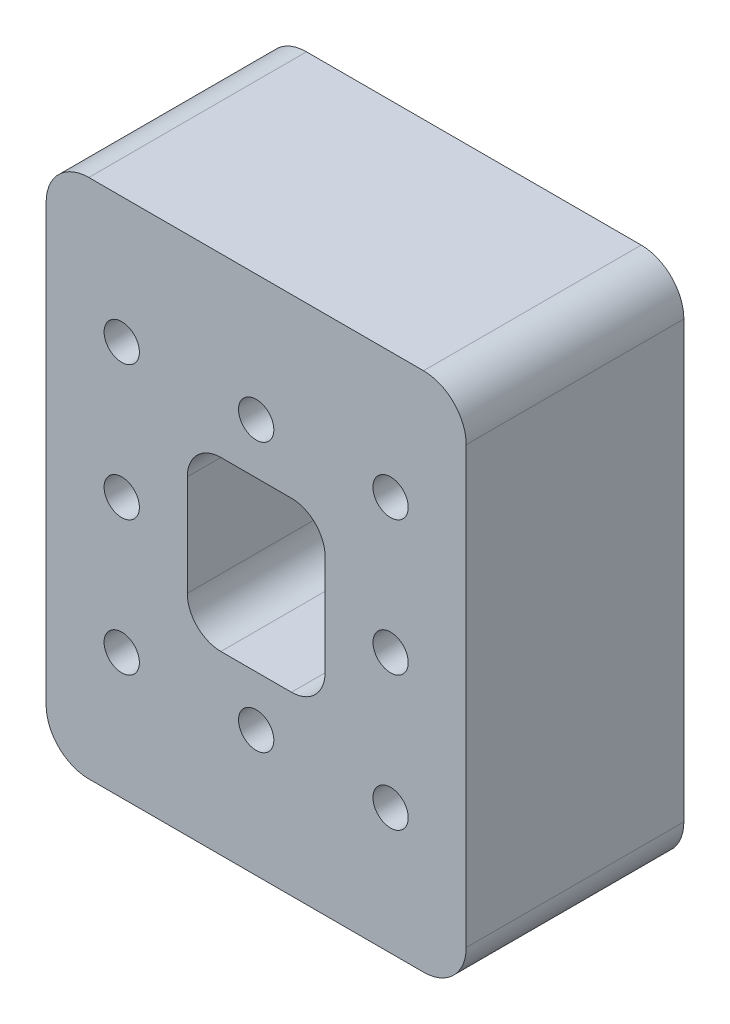
ISO-10303-21;
HEADER;
FILE_DESCRIPTION(('STEP AP214'),'2;1');
FILE_NAME('part.step','',(''),(''),'','','');
FILE_SCHEMA(('AUTOMOTIVE_DESIGN { 1 0 10303 214 1 1 1 1 }'));
ENDSEC;
DATA;
#1=APPLICATION_CONTEXT('core data for automotive mechanical design processes');
#2=APPLICATION_PROTOCOL_DEFINITION('international standard','automotive_design',2000,#1);
#3=PRODUCT_CONTEXT('',#1,'mechanical');
#4=PRODUCT('Part','Part','',(#3));
#5=PRODUCT_RELATED_PRODUCT_CATEGORY('part','',(#4));
#6=PRODUCT_DEFINITION_FORMATION('','',#4);
#7=PRODUCT_DEFINITION_CONTEXT('part definition',#1,'design');
#8=PRODUCT_DEFINITION('design','',#6,#7);
#9=PRODUCT_DEFINITION_SHAPE('','',#8);
#10=(LENGTH_UNIT() NAMED_UNIT(*) SI_UNIT(.MILLI.,.METRE.));
#11=(NAMED_UNIT(*) PLANE_ANGLE_UNIT() SI_UNIT($,.RADIAN.));
#12=(NAMED_UNIT(*) SI_UNIT($,.STERADIAN.) SOLID_ANGLE_UNIT());
#13=UNCERTAINTY_MEASURE_WITH_UNIT(LENGTH_MEASURE(1.E-05),#10,'distance_accuracy_value','');
#14=(GEOMETRIC_REPRESENTATION_CONTEXT(3) GLOBAL_UNCERTAINTY_ASSIGNED_CONTEXT((#13)) GLOBAL_UNIT_ASSIGNED_CONTEXT((#10,
#11,#12)) REPRESENTATION_CONTEXT('',''));
#15=CARTESIAN_POINT('',(0.,0.,0.));
#16=DIRECTION('',(0.,0.,1.));
#17=DIRECTION('',(1.,0.,0.));
#18=AXIS2_PLACEMENT_3D('',#15,#16,#17);
#19=CARTESIAN_POINT('',(2.54000000000001,-2.54,-12.954));
#20=DIRECTION('',(0.,0.,1.));
#21=DIRECTION('',(1.,0.,0.));
#22=AXIS2_PLACEMENT_3D('',#19,#20,#21);
#23=PLANE('',#22);
#24=CARTESIAN_POINT('',(2.54000000000001,-2.54,-12.954));
#25=DIRECTION('',(0.,0.,-1.));
#26=DIRECTION('',(1.,0.,0.));
#27=AXIS2_PLACEMENT_3D('',#24,#25,#26);
#28=CIRCLE('',#27,2.54);
#29=CARTESIAN_POINT('',(0.,-2.54000000000003,-12.954));
#30=VERTEX_POINT('',#29);
#31=CARTESIAN_POINT('',(2.54000000000003,0.,-12.954));
#32=VERTEX_POINT('',#31);
#33=EDGE_CURVE('E245',#30,#32,#28,.T.);
#34=ORIENTED_EDGE('',*,*,#33,.T.);
#35=DIRECTION('',(1.,0.,0.));
#36=VECTOR('',#35,1.);
#37=CARTESIAN_POINT('',(22.46,0.,-12.954));
#38=LINE('',#37,#36);
#39=CARTESIAN_POINT('',(22.46,0.,-12.954));
#40=VERTEX_POINT('',#39);
#41=EDGE_CURVE('E249',#32,#40,#38,.T.);
#42=ORIENTED_EDGE('',*,*,#41,.T.);
#43=CARTESIAN_POINT('',(22.46,-2.54,-12.954));
#44=DIRECTION('',(0.,0.,-1.));
#45=DIRECTION('',(1.,0.,0.));
#46=AXIS2_PLACEMENT_3D('',#43,#44,#45);
#47=CIRCLE('',#46,2.54);
#48=CARTESIAN_POINT('',(25.,-2.54000000000002,-12.954));
#49=VERTEX_POINT('',#48);
#50=EDGE_CURVE('E253',#40,#49,#47,.T.);
#51=ORIENTED_EDGE('',*,*,#50,.T.);
#52=DIRECTION('',(0.,-1.,0.));
#53=VECTOR('',#52,1.);
#54=CARTESIAN_POINT('',(25.,-28.46,-12.954));
#55=LINE('',#54,#53);
#56=CARTESIAN_POINT('',(25.,-28.46,-12.954));
#57=VERTEX_POINT('',#56);
#58=EDGE_CURVE('E256',#49,#57,#55,.T.);
#59=ORIENTED_EDGE('',*,*,#58,.T.);
#60=CARTESIAN_POINT('',(22.46,-28.46,-12.954));
#61=DIRECTION('',(0.,0.,-1.));
#62=DIRECTION('',(1.,0.,0.));
#63=AXIS2_PLACEMENT_3D('',#60,#61,#62);
#64=CIRCLE('',#63,2.54);
#65=CARTESIAN_POINT('',(22.46,-31.,-12.954));
#66=VERTEX_POINT('',#65);
#67=EDGE_CURVE('E259',#57,#66,#64,.T.);
#68=ORIENTED_EDGE('',*,*,#67,.T.);
#69=DIRECTION('',(-1.,0.,0.));
#70=VECTOR('',#69,1.);
#71=CARTESIAN_POINT('',(2.54000000000011,-31.,-12.954));
#72=LINE('',#71,#70);
#73=CARTESIAN_POINT('',(2.54000000000011,-31.,-12.954));
#74=VERTEX_POINT('',#73);
#75=EDGE_CURVE('E262',#66,#74,#72,.T.);
#76=ORIENTED_EDGE('',*,*,#75,.T.);
#77=CARTESIAN_POINT('',(2.54000000000009,-28.46,-12.954));
#78=DIRECTION('',(0.,0.,-1.));
#79=DIRECTION('',(1.,0.,0.));
#80=AXIS2_PLACEMENT_3D('',#77,#78,#79);
#81=CIRCLE('',#80,2.54);
#82=CARTESIAN_POINT('',(0.,-28.46,-12.954));
#83=VERTEX_POINT('',#82);
#84=EDGE_CURVE('E265',#74,#83,#81,.T.);
#85=ORIENTED_EDGE('',*,*,#84,.T.);
#86=DIRECTION('',(0.,1.,0.));
#87=VECTOR('',#86,1.);
#88=CARTESIAN_POINT('',(0.,-2.54000000000003,-12.954));
#89=LINE('',#88,#87);
#90=EDGE_CURVE('E268',#83,#30,#89,.T.);
#91=ORIENTED_EDGE('',*,*,#90,.T.);
#92=EDGE_LOOP('',(#34,#42,#51,#59,#68,#76,#85,#91));
#93=FACE_BOUND('',#92,.T.);
#94=CARTESIAN_POINT('',(14.6,-12.4996962120548,-12.954));
#95=DIRECTION('',(0.,0.,-1.));
#96=DIRECTION('',(-1.,0.,0.));
#97=AXIS2_PLACEMENT_3D('',#94,#95,#96);
#98=CIRCLE('',#97,2.00000000000002);
#99=CARTESIAN_POINT('',(14.6,-10.4996962120548,-12.954));
#100=VERTEX_POINT('',#99);
#101=CARTESIAN_POINT('',(16.6,-12.4996962120548,-12.954));
#102=VERTEX_POINT('',#101);
#103=EDGE_CURVE('E153',#100,#102,#98,.T.);
#104=ORIENTED_EDGE('',*,*,#103,.F.);
#105=DIRECTION('',(1.,0.,0.));
#106=VECTOR('',#105,1.);
#107=CARTESIAN_POINT('',(10.4,-10.4996962120548,-12.954));
#108=LINE('',#107,#106);
#109=CARTESIAN_POINT('',(10.4,-10.4996962120548,-12.954));
#110=VERTEX_POINT('',#109);
#111=EDGE_CURVE('E196',#110,#100,#108,.T.);
#112=ORIENTED_EDGE('',*,*,#111,.F.);
#113=CARTESIAN_POINT('',(10.4,-12.4996962120548,-12.954));
#114=DIRECTION('',(0.,0.,-1.));
#115=DIRECTION('',(-1.,0.,0.));
#116=AXIS2_PLACEMENT_3D('',#113,#114,#115);
#117=CIRCLE('',#116,2.);
#118=CARTESIAN_POINT('',(8.4,-12.4996962120548,-12.954));
#119=VERTEX_POINT('',#118);
#120=EDGE_CURVE('E193',#119,#110,#117,.T.);
#121=ORIENTED_EDGE('',*,*,#120,.F.);
#122=DIRECTION('',(0.,1.,0.));
#123=VECTOR('',#122,1.);
#124=CARTESIAN_POINT('',(8.4,-18.5003037879452,-12.954));
#125=LINE('',#124,#123);
#126=CARTESIAN_POINT('',(8.4,-18.5003037879452,-12.954));
#127=VERTEX_POINT('',#126);
#128=EDGE_CURVE('E190',#127,#119,#125,.T.);
#129=ORIENTED_EDGE('',*,*,#128,.F.);
#130=CARTESIAN_POINT('',(10.4,-18.5003037879452,-12.954));
#131=DIRECTION('',(0.,0.,-1.));
#132=DIRECTION('',(-1.,0.,0.));
#133=AXIS2_PLACEMENT_3D('',#130,#131,#132);
#134=CIRCLE('',#133,1.99999999999997);
#135=CARTESIAN_POINT('',(10.4,-20.5003037879451,-12.954));
#136=VERTEX_POINT('',#135);
#137=EDGE_CURVE('E187',#136,#127,#134,.T.);
#138=ORIENTED_EDGE('',*,*,#137,.F.);
#139=DIRECTION('',(-1.,0.,0.));
#140=VECTOR('',#139,1.);
#141=CARTESIAN_POINT('',(14.6,-20.5003037879451,-12.954));
#142=LINE('',#141,#140);
#143=CARTESIAN_POINT('',(14.6,-20.5003037879451,-12.954));
#144=VERTEX_POINT('',#143);
#145=EDGE_CURVE('E181',#144,#136,#142,.T.);
#146=ORIENTED_EDGE('',*,*,#145,.F.);
#147=CARTESIAN_POINT('',(14.6,-18.5003037879452,-12.954));
#148=DIRECTION('',(0.,0.,-1.));
#149=DIRECTION('',(-1.,0.,0.));
#150=AXIS2_PLACEMENT_3D('',#147,#148,#149);
#151=CIRCLE('',#150,1.99999999999992);
#152=CARTESIAN_POINT('',(16.5999999999999,-18.5003037879452,-12.954));
#153=VERTEX_POINT('',#152);
#154=EDGE_CURVE('E177',#153,#144,#151,.T.);
#155=ORIENTED_EDGE('',*,*,#154,.F.);
#156=DIRECTION('',(0.,-1.,0.));
#157=VECTOR('',#156,1.);
#158=CARTESIAN_POINT('',(16.6,-12.4996962120548,-12.954));
#159=LINE('',#158,#157);
#160=EDGE_CURVE('E162',#102,#153,#159,.T.);
#161=ORIENTED_EDGE('',*,*,#160,.F.);
#162=EDGE_LOOP('',(#104,#112,#121,#129,#138,#146,#155,#161));
#163=FACE_BOUND('',#162,.T.);
#164=CARTESIAN_POINT('',(12.5,-23.5,-12.954));
#165=DIRECTION('',(0.,0.,-1.));
#166=DIRECTION('',(-1.,0.,0.));
#167=AXIS2_PLACEMENT_3D('',#164,#165,#166);
#168=CIRCLE('',#167,1.05);
#169=CARTESIAN_POINT('',(11.45,-23.5,-12.954));
#170=VERTEX_POINT('',#169);
#171=EDGE_CURVE('E201',#170,#170,#168,.T.);
#172=ORIENTED_EDGE('',*,*,#171,.F.);
#173=EDGE_LOOP('',(#172));
#174=FACE_BOUND('',#173,.T.);
#175=CARTESIAN_POINT('',(20.5,-23.5,-12.954));
#176=DIRECTION('',(0.,0.,-1.));
#177=DIRECTION('',(-1.,0.,0.));
#178=AXIS2_PLACEMENT_3D('',#175,#176,#177);
#179=CIRCLE('',#178,1.05);
#180=CARTESIAN_POINT('',(19.45,-23.5,-12.954));
#181=VERTEX_POINT('',#180);
#182=EDGE_CURVE('E498',#181,#181,#179,.T.);
#183=ORIENTED_EDGE('',*,*,#182,.F.);
#184=EDGE_LOOP('',(#183));
#185=FACE_BOUND('',#184,.T.);
#186=CARTESIAN_POINT('',(4.5,-7.5,-12.954));
#187=DIRECTION('',(0.,0.,-1.));
#188=DIRECTION('',(-1.,0.,0.));
#189=AXIS2_PLACEMENT_3D('',#186,#187,#188);
#190=CIRCLE('',#189,1.05);
#191=CARTESIAN_POINT('',(3.45,-7.5,-12.954));
#192=VERTEX_POINT('',#191);
#193=EDGE_CURVE('E490',#192,#192,#190,.T.);
#194=ORIENTED_EDGE('',*,*,#193,.F.);
#195=EDGE_LOOP('',(#194));
#196=FACE_BOUND('',#195,.T.);
#197=CARTESIAN_POINT('',(12.5,-7.5,-12.954));
#198=DIRECTION('',(0.,0.,-1.));
#199=DIRECTION('',(-1.,0.,0.));
#200=AXIS2_PLACEMENT_3D('',#197,#198,#199);
#201=CIRCLE('',#200,1.05);
#202=CARTESIAN_POINT('',(11.45,-7.5,-12.954));
#203=VERTEX_POINT('',#202);
#204=EDGE_CURVE('E482',#203,#203,#201,.T.);
#205=ORIENTED_EDGE('',*,*,#204,.F.);
#206=EDGE_LOOP('',(#205));
#207=FACE_BOUND('',#206,.T.);
#208=CARTESIAN_POINT('',(20.5,-7.5,-12.954));
#209=DIRECTION('',(0.,0.,-1.));
#210=DIRECTION('',(-1.,0.,0.));
#211=AXIS2_PLACEMENT_3D('',#208,#209,#210);
#212=CIRCLE('',#211,1.05);
#213=CARTESIAN_POINT('',(19.45,-7.5,-12.954));
#214=VERTEX_POINT('',#213);
#215=EDGE_CURVE('E474',#214,#214,#212,.T.);
#216=ORIENTED_EDGE('',*,*,#215,.F.);
#217=EDGE_LOOP('',(#216));
#218=FACE_BOUND('',#217,.T.);
#219=CARTESIAN_POINT('',(4.5,-15.5,-12.954));
#220=DIRECTION('',(0.,0.,-1.));
#221=DIRECTION('',(-1.,0.,0.));
#222=AXIS2_PLACEMENT_3D('',#219,#220,#221);
#223=CIRCLE('',#222,1.05);
#224=CARTESIAN_POINT('',(3.45,-15.5,-12.954));
#225=VERTEX_POINT('',#224);
#226=EDGE_CURVE('E466',#225,#225,#223,.T.);
#227=ORIENTED_EDGE('',*,*,#226,.F.);
#228=EDGE_LOOP('',(#227));
#229=FACE_BOUND('',#228,.T.);
#230=CARTESIAN_POINT('',(20.5,-15.5,-12.954));
#231=DIRECTION('',(0.,0.,-1.));
#232=DIRECTION('',(-1.,0.,0.));
#233=AXIS2_PLACEMENT_3D('',#230,#231,#232);
#234=CIRCLE('',#233,1.05);
#235=CARTESIAN_POINT('',(19.45,-15.5,-12.954));
#236=VERTEX_POINT('',#235);
#237=EDGE_CURVE('E458',#236,#236,#234,.T.);
#238=ORIENTED_EDGE('',*,*,#237,.F.);
#239=EDGE_LOOP('',(#238));
#240=FACE_BOUND('',#239,.T.);
#241=CARTESIAN_POINT('',(4.5,-23.5,-12.954));
#242=DIRECTION('',(0.,0.,-1.));
#243=DIRECTION('',(-1.,0.,0.));
#244=AXIS2_PLACEMENT_3D('',#241,#242,#243);
#245=CIRCLE('',#244,1.05);
#246=CARTESIAN_POINT('',(3.45,-23.5,-12.954));
#247=VERTEX_POINT('',#246);
#248=EDGE_CURVE('E447',#247,#247,#245,.T.);
#249=ORIENTED_EDGE('',*,*,#248,.F.);
#250=EDGE_LOOP('',(#249));
#251=FACE_BOUND('',#250,.T.);
#252=ADVANCED_FACE('F39',(#93,#163,#174,#185,#196,#207,#218,#229,#240,#251),#23,.F.);
#253=CARTESIAN_POINT('',(2.54000000000001,-2.54,0.));
#254=DIRECTION('',(0.,0.,1.));
#255=DIRECTION('',(1.,0.,0.));
#256=AXIS2_PLACEMENT_3D('',#253,#254,#255);
#257=PLANE('',#256);
#258=CARTESIAN_POINT('',(20.5,-15.5,0.));
#259=DIRECTION('',(0.,0.,-1.));
#260=DIRECTION('',(-1.,0.,0.));
#261=AXIS2_PLACEMENT_3D('',#258,#259,#260);
#262=CIRCLE('',#261,1.05);
#263=CARTESIAN_POINT('',(19.45,-15.5,0.));
#264=VERTEX_POINT('',#263);
#265=EDGE_CURVE('E455',#264,#264,#262,.T.);
#266=ORIENTED_EDGE('',*,*,#265,.T.);
#267=EDGE_LOOP('',(#266));
#268=FACE_BOUND('',#267,.T.);
#269=CARTESIAN_POINT('',(20.5,-7.5,0.));
#270=DIRECTION('',(0.,0.,-1.));
#271=DIRECTION('',(-1.,0.,0.));
#272=AXIS2_PLACEMENT_3D('',#269,#270,#271);
#273=CIRCLE('',#272,1.05);
#274=CARTESIAN_POINT('',(19.45,-7.5,0.));
#275=VERTEX_POINT('',#274);
#276=EDGE_CURVE('E470',#275,#275,#273,.T.);
#277=ORIENTED_EDGE('',*,*,#276,.T.);
#278=EDGE_LOOP('',(#277));
#279=FACE_BOUND('',#278,.T.);
#280=CARTESIAN_POINT('',(4.5,-7.5,0.));
#281=DIRECTION('',(0.,0.,-1.));
#282=DIRECTION('',(-1.,0.,0.));
#283=AXIS2_PLACEMENT_3D('',#280,#281,#282);
#284=CIRCLE('',#283,1.05);
#285=CARTESIAN_POINT('',(3.45,-7.5,0.));
#286=VERTEX_POINT('',#285);
#287=EDGE_CURVE('E486',#286,#286,#284,.T.);
#288=ORIENTED_EDGE('',*,*,#287,.T.);
#289=EDGE_LOOP('',(#288));
#290=FACE_BOUND('',#289,.T.);
#291=CARTESIAN_POINT('',(12.5,-23.5,0.));
#292=DIRECTION('',(0.,0.,-1.));
#293=DIRECTION('',(-1.,0.,0.));
#294=AXIS2_PLACEMENT_3D('',#291,#292,#293);
#295=CIRCLE('',#294,1.05);
#296=CARTESIAN_POINT('',(11.45,-23.5,0.));
#297=VERTEX_POINT('',#296);
#298=EDGE_CURVE('E502',#297,#297,#295,.T.);
#299=ORIENTED_EDGE('',*,*,#298,.T.);
#300=EDGE_LOOP('',(#299));
#301=FACE_BOUND('',#300,.T.);
#302=CARTESIAN_POINT('',(2.54000000000001,-2.54,0.));
#303=DIRECTION('',(0.,0.,-1.));
#304=DIRECTION('',(1.,0.,0.));
#305=AXIS2_PLACEMENT_3D('',#302,#303,#304);
#306=CIRCLE('',#305,2.54);
#307=CARTESIAN_POINT('',(0.,-2.54000000000003,0.));
#308=VERTEX_POINT('',#307);
#309=CARTESIAN_POINT('',(2.54000000000003,0.,0.));
#310=VERTEX_POINT('',#309);
#311=EDGE_CURVE('E171',#308,#310,#306,.T.);
#312=ORIENTED_EDGE('',*,*,#311,.F.);
#313=DIRECTION('',(0.,1.,0.));
#314=VECTOR('',#313,1.);
#315=CARTESIAN_POINT('',(0.,-2.54000000000003,0.));
#316=LINE('',#315,#314);
#317=CARTESIAN_POINT('',(0.,-28.46,0.));
#318=VERTEX_POINT('',#317);
#319=EDGE_CURVE('E250',#318,#308,#316,.T.);
#320=ORIENTED_EDGE('',*,*,#319,.F.);
#321=CARTESIAN_POINT('',(2.54000000000009,-28.46,0.));
#322=DIRECTION('',(0.,0.,-1.));
#323=DIRECTION('',(1.,0.,0.));
#324=AXIS2_PLACEMENT_3D('',#321,#322,#323);
#325=CIRCLE('',#324,2.54);
#326=CARTESIAN_POINT('',(2.54000000000011,-31.,0.));
#327=VERTEX_POINT('',#326);
#328=EDGE_CURVE('E290',#327,#318,#325,.T.);
#329=ORIENTED_EDGE('',*,*,#328,.F.);
#330=DIRECTION('',(-1.,0.,0.));
#331=VECTOR('',#330,1.);
#332=CARTESIAN_POINT('',(2.54000000000011,-31.,0.));
#333=LINE('',#332,#331);
#334=CARTESIAN_POINT('',(22.46,-31.,0.));
#335=VERTEX_POINT('',#334);
#336=EDGE_CURVE('E287',#335,#327,#333,.T.);
#337=ORIENTED_EDGE('',*,*,#336,.F.);
#338=CARTESIAN_POINT('',(22.46,-28.46,0.));
#339=DIRECTION('',(0.,0.,-1.));
#340=DIRECTION('',(1.,0.,0.));
#341=AXIS2_PLACEMENT_3D('',#338,#339,#340);
#342=CIRCLE('',#341,2.54);
#343=CARTESIAN_POINT('',(25.,-28.46,0.));
#344=VERTEX_POINT('',#343);
#345=EDGE_CURVE('E284',#344,#335,#342,.T.);
#346=ORIENTED_EDGE('',*,*,#345,.F.);
#347=DIRECTION('',(0.,-1.,0.));
#348=VECTOR('',#347,1.);
#349=CARTESIAN_POINT('',(25.,-28.46,0.));
#350=LINE('',#349,#348);
#351=CARTESIAN_POINT('',(25.,-2.54000000000002,0.));
#352=VERTEX_POINT('',#351);
#353=EDGE_CURVE('E281',#352,#344,#350,.T.);
#354=ORIENTED_EDGE('',*,*,#353,.F.);
#355=CARTESIAN_POINT('',(22.46,-2.54,0.));
#356=DIRECTION('',(0.,0.,-1.));
#357=DIRECTION('',(1.,0.,0.));
#358=AXIS2_PLACEMENT_3D('',#355,#356,#357);
#359=CIRCLE('',#358,2.54);
#360=CARTESIAN_POINT('',(22.46,0.,0.));
#361=VERTEX_POINT('',#360);
#362=EDGE_CURVE('E278',#361,#352,#359,.T.);
#363=ORIENTED_EDGE('',*,*,#362,.F.);
#364=DIRECTION('',(1.,0.,0.));
#365=VECTOR('',#364,1.);
#366=CARTESIAN_POINT('',(22.46,0.,0.));
#367=LINE('',#366,#365);
#368=EDGE_CURVE('E275',#310,#361,#367,.T.);
#369=ORIENTED_EDGE('',*,*,#368,.F.);
#370=EDGE_LOOP('',(#312,#320,#329,#337,#346,#354,#363,#369));
#371=FACE_BOUND('',#370,.T.);
#372=DIRECTION('',(1.,0.,0.));
#373=VECTOR('',#372,1.);
#374=CARTESIAN_POINT('',(10.4,-10.4996962120548,0.));
#375=LINE('',#374,#373);
#376=CARTESIAN_POINT('',(10.4,-10.4996962120548,0.));
#377=VERTEX_POINT('',#376);
#378=CARTESIAN_POINT('',(14.6,-10.4996962120548,0.));
#379=VERTEX_POINT('',#378);
#380=EDGE_CURVE('E163',#377,#379,#375,.T.);
#381=ORIENTED_EDGE('',*,*,#380,.T.);
#382=CARTESIAN_POINT('',(14.6,-12.4996962120548,0.));
#383=DIRECTION('',(0.,0.,-1.));
#384=DIRECTION('',(-1.,0.,0.));
#385=AXIS2_PLACEMENT_3D('',#382,#383,#384);
#386=CIRCLE('',#385,2.00000000000002);
#387=CARTESIAN_POINT('',(16.6,-12.4996962120548,0.));
#388=VERTEX_POINT('',#387);
#389=EDGE_CURVE('E63',#379,#388,#386,.T.);
#390=ORIENTED_EDGE('',*,*,#389,.T.);
#391=DIRECTION('',(0.,-1.,0.));
#392=VECTOR('',#391,1.);
#393=CARTESIAN_POINT('',(16.6,-12.4996962120548,0.));
#394=LINE('',#393,#392);
#395=CARTESIAN_POINT('',(16.5999999999999,-18.5003037879452,0.));
#396=VERTEX_POINT('',#395);
#397=EDGE_CURVE('E169',#388,#396,#394,.T.);
#398=ORIENTED_EDGE('',*,*,#397,.T.);
#399=CARTESIAN_POINT('',(14.6,-18.5003037879452,0.));
#400=DIRECTION('',(0.,0.,-1.));
#401=DIRECTION('',(-1.,0.,0.));
#402=AXIS2_PLACEMENT_3D('',#399,#400,#401);
#403=CIRCLE('',#402,1.99999999999992);
#404=CARTESIAN_POINT('',(14.6,-20.5003037879451,0.));
#405=VERTEX_POINT('',#404);
#406=EDGE_CURVE('E204',#396,#405,#403,.T.);
#407=ORIENTED_EDGE('',*,*,#406,.T.);
#408=DIRECTION('',(-1.,0.,0.));
#409=VECTOR('',#408,1.);
#410=CARTESIAN_POINT('',(14.6,-20.5003037879451,0.));
#411=LINE('',#410,#409);
#412=CARTESIAN_POINT('',(10.4,-20.5003037879451,0.));
#413=VERTEX_POINT('',#412);
#414=EDGE_CURVE('E208',#405,#413,#411,.T.);
#415=ORIENTED_EDGE('',*,*,#414,.T.);
#416=CARTESIAN_POINT('',(10.4,-18.5003037879452,0.));
#417=DIRECTION('',(0.,0.,-1.));
#418=DIRECTION('',(-1.,0.,0.));
#419=AXIS2_PLACEMENT_3D('',#416,#417,#418);
#420=CIRCLE('',#419,1.99999999999997);
#421=CARTESIAN_POINT('',(8.4,-18.5003037879452,0.));
#422=VERTEX_POINT('',#421);
#423=EDGE_CURVE('E212',#413,#422,#420,.T.);
#424=ORIENTED_EDGE('',*,*,#423,.T.);
#425=DIRECTION('',(0.,1.,0.));
#426=VECTOR('',#425,1.);
#427=CARTESIAN_POINT('',(8.4,-18.5003037879452,0.));
#428=LINE('',#427,#426);
#429=CARTESIAN_POINT('',(8.4,-12.4996962120548,0.));
#430=VERTEX_POINT('',#429);
#431=EDGE_CURVE('E216',#422,#430,#428,.T.);
#432=ORIENTED_EDGE('',*,*,#431,.T.);
#433=CARTESIAN_POINT('',(10.4,-12.4996962120548,0.));
#434=DIRECTION('',(0.,0.,-1.));
#435=DIRECTION('',(-1.,0.,0.));
#436=AXIS2_PLACEMENT_3D('',#433,#434,#435);
#437=CIRCLE('',#436,2.);
#438=EDGE_CURVE('E220',#430,#377,#437,.T.);
#439=ORIENTED_EDGE('',*,*,#438,.T.);
#440=EDGE_LOOP('',(#381,#390,#398,#407,#415,#424,#432,#439));
#441=FACE_BOUND('',#440,.T.);
#442=CARTESIAN_POINT('',(20.5,-23.5,0.));
#443=DIRECTION('',(0.,0.,-1.));
#444=DIRECTION('',(-1.,0.,0.));
#445=AXIS2_PLACEMENT_3D('',#442,#443,#444);
#446=CIRCLE('',#445,1.05);
#447=CARTESIAN_POINT('',(19.45,-23.5,0.));
#448=VERTEX_POINT('',#447);
#449=EDGE_CURVE('E494',#448,#448,#446,.T.);
#450=ORIENTED_EDGE('',*,*,#449,.T.);
#451=EDGE_LOOP('',(#450));
#452=FACE_BOUND('',#451,.T.);
#453=CARTESIAN_POINT('',(12.5,-7.5,0.));
#454=DIRECTION('',(0.,0.,-1.));
#455=DIRECTION('',(-1.,0.,0.));
#456=AXIS2_PLACEMENT_3D('',#453,#454,#455);
#457=CIRCLE('',#456,1.05);
#458=CARTESIAN_POINT('',(11.45,-7.5,0.));
#459=VERTEX_POINT('',#458);
#460=EDGE_CURVE('E478',#459,#459,#457,.T.);
#461=ORIENTED_EDGE('',*,*,#460,.T.);
#462=EDGE_LOOP('',(#461));
#463=FACE_BOUND('',#462,.T.);
#464=CARTESIAN_POINT('',(4.5,-15.5,0.));
#465=DIRECTION('',(0.,0.,-1.));
#466=DIRECTION('',(-1.,0.,0.));
#467=AXIS2_PLACEMENT_3D('',#464,#465,#466);
#468=CIRCLE('',#467,1.05);
#469=CARTESIAN_POINT('',(3.45,-15.5,0.));
#470=VERTEX_POINT('',#469);
#471=EDGE_CURVE('E462',#470,#470,#468,.T.);
#472=ORIENTED_EDGE('',*,*,#471,.T.);
#473=EDGE_LOOP('',(#472));
#474=FACE_BOUND('',#473,.T.);
#475=CARTESIAN_POINT('',(4.5,-23.5,0.));
#476=DIRECTION('',(0.,0.,-1.));
#477=DIRECTION('',(-1.,0.,0.));
#478=AXIS2_PLACEMENT_3D('',#475,#476,#477);
#479=CIRCLE('',#478,1.05);
#480=CARTESIAN_POINT('',(3.45,-23.5,0.));
#481=VERTEX_POINT('',#480);
#482=EDGE_CURVE('E450',#481,#481,#479,.T.);
#483=ORIENTED_EDGE('',*,*,#482,.T.);
#484=EDGE_LOOP('',(#483));
#485=FACE_BOUND('',#484,.T.);
#486=ADVANCED_FACE('F329',(#268,#279,#290,#301,#371,#441,#452,#463,#474,#485),#257,.T.);
#487=CARTESIAN_POINT('',(2.54000000000001,-2.54,-12.954));
#488=DIRECTION('',(0.,0.,1.));
#489=DIRECTION('',(1.,0.,0.));
#490=AXIS2_PLACEMENT_3D('',#487,#488,#489);
#491=CYLINDRICAL_SURFACE('',#490,2.54);
#492=ORIENTED_EDGE('',*,*,#311,.T.);
#493=DIRECTION('',(0.,0.,1.));
#494=VECTOR('',#493,1.);
#495=CARTESIAN_POINT('',(2.54000000000003,0.,-12.954));
#496=LINE('',#495,#494);
#497=EDGE_CURVE('E11',#32,#310,#496,.T.);
#498=ORIENTED_EDGE('',*,*,#497,.F.);
#499=ORIENTED_EDGE('',*,*,#33,.F.);
#500=DIRECTION('',(0.,0.,1.));
#501=VECTOR('',#500,1.);
#502=CARTESIAN_POINT('',(0.,-2.54000000000003,-12.954));
#503=LINE('',#502,#501);
#504=EDGE_CURVE('E271',#30,#308,#503,.T.);
#505=ORIENTED_EDGE('',*,*,#504,.T.);
#506=EDGE_LOOP('',(#492,#498,#499,#505));
#507=FACE_BOUND('',#506,.T.);
#508=ADVANCED_FACE('F41',(#507),#491,.T.);
#509=CARTESIAN_POINT('',(22.46,0.,-12.954));
#510=DIRECTION('',(0.,-1.,0.));
#511=DIRECTION('',(0.,0.,-1.));
#512=AXIS2_PLACEMENT_3D('',#509,#510,#511);
#513=PLANE('',#512);
#514=ORIENTED_EDGE('',*,*,#368,.T.);
#515=DIRECTION('',(0.,0.,1.));
#516=VECTOR('',#515,1.);
#517=CARTESIAN_POINT('',(22.46,0.,-12.954));
#518=LINE('',#517,#516);
#519=EDGE_CURVE('E48',#40,#361,#518,.T.);
#520=ORIENTED_EDGE('',*,*,#519,.F.);
#521=ORIENTED_EDGE('',*,*,#41,.F.);
#522=ORIENTED_EDGE('',*,*,#497,.T.);
#523=EDGE_LOOP('',(#514,#520,#521,#522));
#524=FACE_BOUND('',#523,.T.);
#525=ADVANCED_FACE('F346',(#524),#513,.F.);
#526=CARTESIAN_POINT('',(22.46,-2.54,-12.954));
#527=DIRECTION('',(0.,0.,1.));
#528=DIRECTION('',(1.,0.,0.));
#529=AXIS2_PLACEMENT_3D('',#526,#527,#528);
#530=CYLINDRICAL_SURFACE('',#529,2.54);
#531=ORIENTED_EDGE('',*,*,#362,.T.);
#532=DIRECTION('',(0.,0.,1.));
#533=VECTOR('',#532,1.);
#534=CARTESIAN_POINT('',(25.,-2.54000000000002,-12.954));
#535=LINE('',#534,#533);
#536=EDGE_CURVE('E314',#49,#352,#535,.T.);
#537=ORIENTED_EDGE('',*,*,#536,.F.);
#538=ORIENTED_EDGE('',*,*,#50,.F.);
#539=ORIENTED_EDGE('',*,*,#519,.T.);
#540=EDGE_LOOP('',(#531,#537,#538,#539));
#541=FACE_BOUND('',#540,.T.);
#542=ADVANCED_FACE('F323',(#541),#530,.T.);
#543=CARTESIAN_POINT('',(25.,-28.46,-12.954));
#544=DIRECTION('',(-1.,0.,0.));
#545=DIRECTION('',(0.,0.,1.));
#546=AXIS2_PLACEMENT_3D('',#543,#544,#545);
#547=PLANE('',#546);
#548=ORIENTED_EDGE('',*,*,#353,.T.);
#549=DIRECTION('',(0.,0.,1.));
#550=VECTOR('',#549,1.);
#551=CARTESIAN_POINT('',(25.,-28.46,-12.954));
#552=LINE('',#551,#550);
#553=EDGE_CURVE('E310',#57,#344,#552,.T.);
#554=ORIENTED_EDGE('',*,*,#553,.F.);
#555=ORIENTED_EDGE('',*,*,#58,.F.);
#556=ORIENTED_EDGE('',*,*,#536,.T.);
#557=EDGE_LOOP('',(#548,#554,#555,#556));
#558=FACE_BOUND('',#557,.T.);
#559=ADVANCED_FACE('F335',(#558),#547,.F.);
#560=CARTESIAN_POINT('',(22.46,-28.46,-12.954));
#561=DIRECTION('',(0.,0.,1.));
#562=DIRECTION('',(1.,0.,0.));
#563=AXIS2_PLACEMENT_3D('',#560,#561,#562);
#564=CYLINDRICAL_SURFACE('',#563,2.54);
#565=ORIENTED_EDGE('',*,*,#345,.T.);
#566=DIRECTION('',(0.,0.,1.));
#567=VECTOR('',#566,1.);
#568=CARTESIAN_POINT('',(22.46,-31.,-12.954));
#569=LINE('',#568,#567);
#570=EDGE_CURVE('E306',#66,#335,#569,.T.);
#571=ORIENTED_EDGE('',*,*,#570,.F.);
#572=ORIENTED_EDGE('',*,*,#67,.F.);
#573=ORIENTED_EDGE('',*,*,#553,.T.);
#574=EDGE_LOOP('',(#565,#571,#572,#573));
#575=FACE_BOUND('',#574,.T.);
#576=ADVANCED_FACE('F339',(#575),#564,.T.);
#577=CARTESIAN_POINT('',(2.54000000000011,-31.,-12.954));
#578=DIRECTION('',(0.,1.,0.));
#579=DIRECTION('',(0.,0.,1.));
#580=AXIS2_PLACEMENT_3D('',#577,#578,#579);
#581=PLANE('',#580);
#582=ORIENTED_EDGE('',*,*,#336,.T.);
#583=DIRECTION('',(0.,0.,1.));
#584=VECTOR('',#583,1.);
#585=CARTESIAN_POINT('',(2.54000000000011,-31.,-12.954));
#586=LINE('',#585,#584);
#587=EDGE_CURVE('E302',#74,#327,#586,.T.);
#588=ORIENTED_EDGE('',*,*,#587,.F.);
#589=ORIENTED_EDGE('',*,*,#75,.F.);
#590=ORIENTED_EDGE('',*,*,#570,.T.);
#591=EDGE_LOOP('',(#582,#588,#589,#590));
#592=FACE_BOUND('',#591,.T.);
#593=ADVANCED_FACE('F359',(#592),#581,.F.);
#594=CARTESIAN_POINT('',(2.54000000000009,-28.46,-12.954));
#595=DIRECTION('',(0.,0.,1.));
#596=DIRECTION('',(1.,0.,0.));
#597=AXIS2_PLACEMENT_3D('',#594,#595,#596);
#598=CYLINDRICAL_SURFACE('',#597,2.54);
#599=ORIENTED_EDGE('',*,*,#328,.T.);
#600=DIRECTION('',(0.,0.,1.));
#601=VECTOR('',#600,1.);
#602=CARTESIAN_POINT('',(0.,-28.46,-12.954));
#603=LINE('',#602,#601);
#604=EDGE_CURVE('E298',#83,#318,#603,.T.);
#605=ORIENTED_EDGE('',*,*,#604,.F.);
#606=ORIENTED_EDGE('',*,*,#84,.F.);
#607=ORIENTED_EDGE('',*,*,#587,.T.);
#608=EDGE_LOOP('',(#599,#605,#606,#607));
#609=FACE_BOUND('',#608,.T.);
#610=ADVANCED_FACE('F357',(#609),#598,.T.);
#611=CARTESIAN_POINT('',(0.,-2.54000000000003,-12.954));
#612=DIRECTION('',(1.,0.,0.));
#613=DIRECTION('',(0.,1.,0.));
#614=AXIS2_PLACEMENT_3D('',#611,#612,#613);
#615=PLANE('',#614);
#616=ORIENTED_EDGE('',*,*,#319,.T.);
#617=ORIENTED_EDGE('',*,*,#504,.F.);
#618=ORIENTED_EDGE('',*,*,#90,.F.);
#619=ORIENTED_EDGE('',*,*,#604,.T.);
#620=EDGE_LOOP('',(#616,#617,#618,#619));
#621=FACE_BOUND('',#620,.T.);
#622=ADVANCED_FACE('F352',(#621),#615,.F.);
#623=CARTESIAN_POINT('',(14.6,-12.4996962120548,-12.954));
#624=DIRECTION('',(0.,0.,1.));
#625=DIRECTION('',(1.,0.,0.));
#626=AXIS2_PLACEMENT_3D('',#623,#624,#625);
#627=CYLINDRICAL_SURFACE('',#626,2.00000000000002);
#628=ORIENTED_EDGE('',*,*,#389,.F.);
#629=DIRECTION('',(0.,0.,1.));
#630=VECTOR('',#629,1.);
#631=CARTESIAN_POINT('',(14.6,-10.4996962120548,-12.954));
#632=LINE('',#631,#630);
#633=EDGE_CURVE('E157',#100,#379,#632,.T.);
#634=ORIENTED_EDGE('',*,*,#633,.F.);
#635=ORIENTED_EDGE('',*,*,#103,.T.);
#636=DIRECTION('',(0.,0.,1.));
#637=VECTOR('',#636,1.);
#638=CARTESIAN_POINT('',(16.6,-12.4996962120548,-12.954));
#639=LINE('',#638,#637);
#640=EDGE_CURVE('E156',#102,#388,#639,.T.);
#641=ORIENTED_EDGE('',*,*,#640,.T.);
#642=EDGE_LOOP('',(#628,#634,#635,#641));
#643=FACE_BOUND('',#642,.T.);
#644=ADVANCED_FACE('F155',(#643),#627,.F.);
#645=CARTESIAN_POINT('',(16.6,-12.4996962120548,-12.954));
#646=DIRECTION('',(-1.,0.,0.));
#647=DIRECTION('',(0.,-1.,0.));
#648=AXIS2_PLACEMENT_3D('',#645,#646,#647);
#649=PLANE('',#648);
#650=ORIENTED_EDGE('',*,*,#397,.F.);
#651=ORIENTED_EDGE('',*,*,#640,.F.);
#652=ORIENTED_EDGE('',*,*,#160,.T.);
#653=DIRECTION('',(0.,0.,1.));
#654=VECTOR('',#653,1.);
#655=CARTESIAN_POINT('',(16.5999999999999,-18.5003037879452,-12.954));
#656=LINE('',#655,#654);
#657=EDGE_CURVE('E172',#153,#396,#656,.T.);
#658=ORIENTED_EDGE('',*,*,#657,.T.);
#659=EDGE_LOOP('',(#650,#651,#652,#658));
#660=FACE_BOUND('',#659,.T.);
#661=ADVANCED_FACE('F166',(#660),#649,.T.);
#662=CARTESIAN_POINT('',(14.6,-18.5003037879452,-12.954));
#663=DIRECTION('',(0.,0.,1.));
#664=DIRECTION('',(1.,0.,0.));
#665=AXIS2_PLACEMENT_3D('',#662,#663,#664);
#666=CYLINDRICAL_SURFACE('',#665,1.99999999999992);
#667=ORIENTED_EDGE('',*,*,#406,.F.);
#668=ORIENTED_EDGE('',*,*,#657,.F.);
#669=ORIENTED_EDGE('',*,*,#154,.T.);
#670=DIRECTION('',(0.,0.,1.));
#671=VECTOR('',#670,1.);
#672=CARTESIAN_POINT('',(14.6,-20.5003037879451,-12.954));
#673=LINE('',#672,#671);
#674=EDGE_CURVE('E240',#144,#405,#673,.T.);
#675=ORIENTED_EDGE('',*,*,#674,.T.);
#676=EDGE_LOOP('',(#667,#668,#669,#675));
#677=FACE_BOUND('',#676,.T.);
#678=ADVANCED_FACE('F385',(#677),#666,.F.);
#679=CARTESIAN_POINT('',(14.6,-20.5003037879451,-12.954));
#680=DIRECTION('',(0.,1.,0.));
#681=DIRECTION('',(-1.,0.,0.));
#682=AXIS2_PLACEMENT_3D('',#679,#680,#681);
#683=PLANE('',#682);
#684=ORIENTED_EDGE('',*,*,#414,.F.);
#685=ORIENTED_EDGE('',*,*,#674,.F.);
#686=ORIENTED_EDGE('',*,*,#145,.T.);
#687=DIRECTION('',(0.,0.,1.));
#688=VECTOR('',#687,1.);
#689=CARTESIAN_POINT('',(10.4,-20.5003037879451,-12.954));
#690=LINE('',#689,#688);
#691=EDGE_CURVE('E237',#136,#413,#690,.T.);
#692=ORIENTED_EDGE('',*,*,#691,.T.);
#693=EDGE_LOOP('',(#684,#685,#686,#692));
#694=FACE_BOUND('',#693,.T.);
#695=ADVANCED_FACE('F389',(#694),#683,.T.);
#696=CARTESIAN_POINT('',(10.4,-18.5003037879452,-12.954));
#697=DIRECTION('',(0.,0.,1.));
#698=DIRECTION('',(1.,0.,0.));
#699=AXIS2_PLACEMENT_3D('',#696,#697,#698);
#700=CYLINDRICAL_SURFACE('',#699,1.99999999999997);
#701=ORIENTED_EDGE('',*,*,#423,.F.);
#702=ORIENTED_EDGE('',*,*,#691,.F.);
#703=ORIENTED_EDGE('',*,*,#137,.T.);
#704=DIRECTION('',(0.,0.,1.));
#705=VECTOR('',#704,1.);
#706=CARTESIAN_POINT('',(8.4,-18.5003037879452,-12.954));
#707=LINE('',#706,#705);
#708=EDGE_CURVE('E234',#127,#422,#707,.T.);
#709=ORIENTED_EDGE('',*,*,#708,.T.);
#710=EDGE_LOOP('',(#701,#702,#703,#709));
#711=FACE_BOUND('',#710,.T.);
#712=ADVANCED_FACE('F395',(#711),#700,.F.);
#713=CARTESIAN_POINT('',(8.4,-18.5003037879452,-12.954));
#714=DIRECTION('',(1.,0.,0.));
#715=DIRECTION('',(0.,0.,-1.));
#716=AXIS2_PLACEMENT_3D('',#713,#714,#715);
#717=PLANE('',#716);
#718=ORIENTED_EDGE('',*,*,#431,.F.);
#719=ORIENTED_EDGE('',*,*,#708,.F.);
#720=ORIENTED_EDGE('',*,*,#128,.T.);
#721=DIRECTION('',(0.,0.,1.));
#722=VECTOR('',#721,1.);
#723=CARTESIAN_POINT('',(8.4,-12.4996962120548,-12.954));
#724=LINE('',#723,#722);
#725=EDGE_CURVE('E231',#119,#430,#724,.T.);
#726=ORIENTED_EDGE('',*,*,#725,.T.);
#727=EDGE_LOOP('',(#718,#719,#720,#726));
#728=FACE_BOUND('',#727,.T.);
#729=ADVANCED_FACE('F399',(#728),#717,.T.);
#730=CARTESIAN_POINT('',(10.4,-12.4996962120548,-12.954));
#731=DIRECTION('',(0.,0.,1.));
#732=DIRECTION('',(1.,0.,0.));
#733=AXIS2_PLACEMENT_3D('',#730,#731,#732);
#734=CYLINDRICAL_SURFACE('',#733,2.);
#735=ORIENTED_EDGE('',*,*,#438,.F.);
#736=ORIENTED_EDGE('',*,*,#725,.F.);
#737=ORIENTED_EDGE('',*,*,#120,.T.);
#738=DIRECTION('',(0.,0.,1.));
#739=VECTOR('',#738,1.);
#740=CARTESIAN_POINT('',(10.4,-10.4996962120548,-12.954));
#741=LINE('',#740,#739);
#742=EDGE_CURVE('E55',#110,#377,#741,.T.);
#743=ORIENTED_EDGE('',*,*,#742,.T.);
#744=EDGE_LOOP('',(#735,#736,#737,#743));
#745=FACE_BOUND('',#744,.T.);
#746=ADVANCED_FACE('F403',(#745),#734,.F.);
#747=CARTESIAN_POINT('',(10.4,-10.4996962120548,-12.954));
#748=DIRECTION('',(0.,-1.,0.));
#749=DIRECTION('',(1.,0.,0.));
#750=AXIS2_PLACEMENT_3D('',#747,#748,#749);
#751=PLANE('',#750);
#752=ORIENTED_EDGE('',*,*,#380,.F.);
#753=ORIENTED_EDGE('',*,*,#742,.F.);
#754=ORIENTED_EDGE('',*,*,#111,.T.);
#755=ORIENTED_EDGE('',*,*,#633,.T.);
#756=EDGE_LOOP('',(#752,#753,#754,#755));
#757=FACE_BOUND('',#756,.T.);
#758=ADVANCED_FACE('F407',(#757),#751,.T.);
#759=CARTESIAN_POINT('',(12.5,-23.5,-12.954));
#760=DIRECTION('',(0.,0.,1.));
#761=DIRECTION('',(1.,0.,0.));
#762=AXIS2_PLACEMENT_3D('',#759,#760,#761);
#763=CYLINDRICAL_SURFACE('',#762,1.05);
#764=ORIENTED_EDGE('',*,*,#171,.T.);
#765=EDGE_LOOP('',(#764));
#766=FACE_BOUND('',#765,.T.);
#767=ORIENTED_EDGE('',*,*,#298,.F.);
#768=EDGE_LOOP('',(#767));
#769=FACE_BOUND('',#768,.T.);
#770=ADVANCED_FACE('F411',(#766,#769),#763,.F.);
#771=CARTESIAN_POINT('',(20.5,-23.5,-12.954));
#772=DIRECTION('',(0.,0.,1.));
#773=DIRECTION('',(1.,0.,0.));
#774=AXIS2_PLACEMENT_3D('',#771,#772,#773);
#775=CYLINDRICAL_SURFACE('',#774,1.05);
#776=ORIENTED_EDGE('',*,*,#182,.T.);
#777=EDGE_LOOP('',(#776));
#778=FACE_BOUND('',#777,.T.);
#779=ORIENTED_EDGE('',*,*,#449,.F.);
#780=EDGE_LOOP('',(#779));
#781=FACE_BOUND('',#780,.T.);
#782=ADVANCED_FACE('F414',(#778,#781),#775,.F.);
#783=CARTESIAN_POINT('',(4.5,-7.5,-12.954));
#784=DIRECTION('',(0.,0.,1.));
#785=DIRECTION('',(1.,0.,0.));
#786=AXIS2_PLACEMENT_3D('',#783,#784,#785);
#787=CYLINDRICAL_SURFACE('',#786,1.05);
#788=ORIENTED_EDGE('',*,*,#193,.T.);
#789=EDGE_LOOP('',(#788));
#790=FACE_BOUND('',#789,.T.);
#791=ORIENTED_EDGE('',*,*,#287,.F.);
#792=EDGE_LOOP('',(#791));
#793=FACE_BOUND('',#792,.T.);
#794=ADVANCED_FACE('F418',(#790,#793),#787,.F.);
#795=CARTESIAN_POINT('',(12.5,-7.5,-12.954));
#796=DIRECTION('',(0.,0.,1.));
#797=DIRECTION('',(1.,0.,0.));
#798=AXIS2_PLACEMENT_3D('',#795,#796,#797);
#799=CYLINDRICAL_SURFACE('',#798,1.05);
#800=ORIENTED_EDGE('',*,*,#204,.T.);
#801=EDGE_LOOP('',(#800));
#802=FACE_BOUND('',#801,.T.);
#803=ORIENTED_EDGE('',*,*,#460,.F.);
#804=EDGE_LOOP('',(#803));
#805=FACE_BOUND('',#804,.T.);
#806=ADVANCED_FACE('F422',(#802,#805),#799,.F.);
#807=CARTESIAN_POINT('',(20.5,-7.5,-12.954));
#808=DIRECTION('',(0.,0.,1.));
#809=DIRECTION('',(1.,0.,0.));
#810=AXIS2_PLACEMENT_3D('',#807,#808,#809);
#811=CYLINDRICAL_SURFACE('',#810,1.05);
#812=ORIENTED_EDGE('',*,*,#215,.T.);
#813=EDGE_LOOP('',(#812));
#814=FACE_BOUND('',#813,.T.);
#815=ORIENTED_EDGE('',*,*,#276,.F.);
#816=EDGE_LOOP('',(#815));
#817=FACE_BOUND('',#816,.T.);
#818=ADVANCED_FACE('F426',(#814,#817),#811,.F.);
#819=CARTESIAN_POINT('',(4.5,-15.5,-12.954));
#820=DIRECTION('',(0.,0.,1.));
#821=DIRECTION('',(1.,0.,0.));
#822=AXIS2_PLACEMENT_3D('',#819,#820,#821);
#823=CYLINDRICAL_SURFACE('',#822,1.05);
#824=ORIENTED_EDGE('',*,*,#226,.T.);
#825=EDGE_LOOP('',(#824));
#826=FACE_BOUND('',#825,.T.);
#827=ORIENTED_EDGE('',*,*,#471,.F.);
#828=EDGE_LOOP('',(#827));
#829=FACE_BOUND('',#828,.T.);
#830=ADVANCED_FACE('F430',(#826,#829),#823,.F.);
#831=CARTESIAN_POINT('',(20.5,-15.5,-12.954));
#832=DIRECTION('',(0.,0.,1.));
#833=DIRECTION('',(1.,0.,0.));
#834=AXIS2_PLACEMENT_3D('',#831,#832,#833);
#835=CYLINDRICAL_SURFACE('',#834,1.05);
#836=ORIENTED_EDGE('',*,*,#237,.T.);
#837=EDGE_LOOP('',(#836));
#838=FACE_BOUND('',#837,.T.);
#839=ORIENTED_EDGE('',*,*,#265,.F.);
#840=EDGE_LOOP('',(#839));
#841=FACE_BOUND('',#840,.T.);
#842=ADVANCED_FACE('F434',(#838,#841),#835,.F.);
#843=CARTESIAN_POINT('',(4.5,-23.5,-12.954));
#844=DIRECTION('',(0.,0.,1.));
#845=DIRECTION('',(1.,0.,0.));
#846=AXIS2_PLACEMENT_3D('',#843,#844,#845);
#847=CYLINDRICAL_SURFACE('',#846,1.05);
#848=ORIENTED_EDGE('',*,*,#248,.T.);
#849=EDGE_LOOP('',(#848));
#850=FACE_BOUND('',#849,.T.);
#851=ORIENTED_EDGE('',*,*,#482,.F.);
#852=EDGE_LOOP('',(#851));
#853=FACE_BOUND('',#852,.T.);
#854=ADVANCED_FACE('F438',(#850,#853),#847,.F.);
#855=CLOSED_SHELL('',(#252,#486,#508,#525,#542,#559,#576,#593,#610,#622,#644,#661,#678,#695,
#712,#729,#746,#758,#770,#782,#794,#806,#818,#830,#842,#854));
#856=MANIFOLD_SOLID_BREP('B2',#855);
#857=ADVANCED_BREP_SHAPE_REPRESENTATION('',(#18,#856),#14);
#858=SHAPE_DEFINITION_REPRESENTATION(#9,#857);
ENDSEC;
END-ISO-10303-21;
